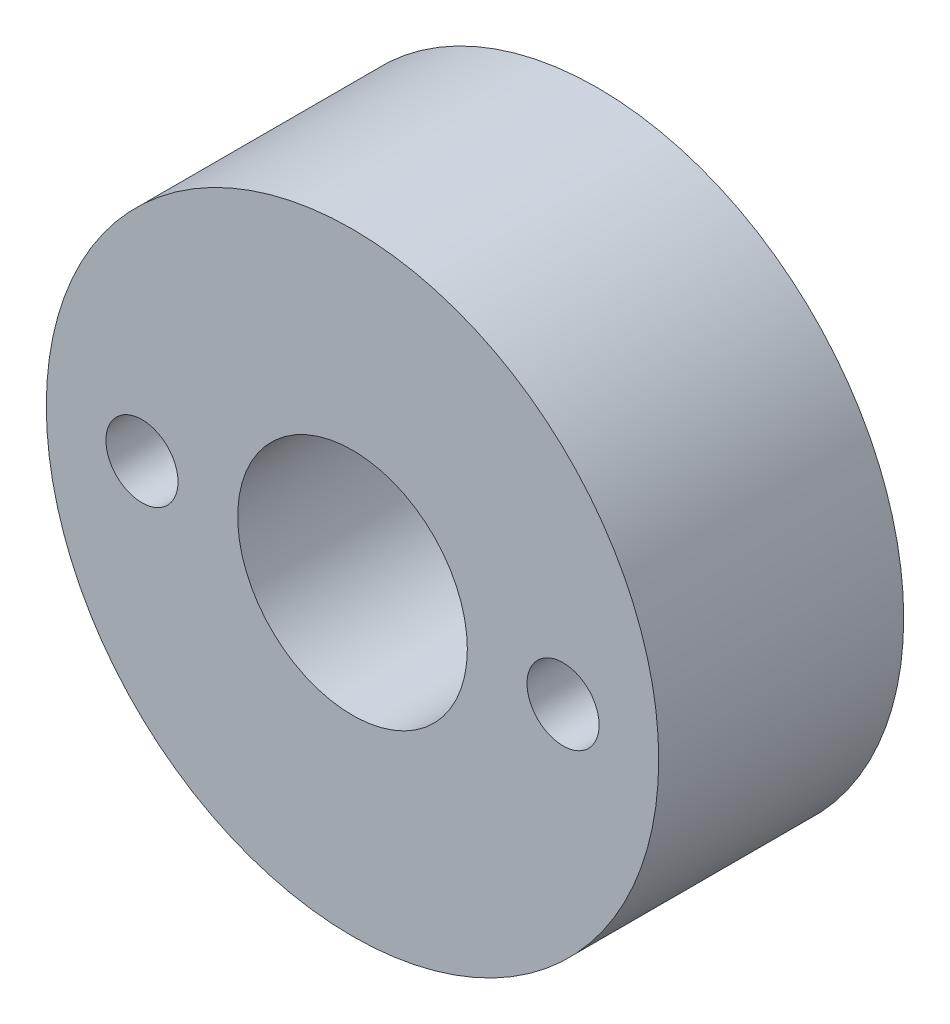
ISO-10303-21;
HEADER;
FILE_DESCRIPTION(('STEP AP214'),'2;1');
FILE_NAME('part.step','',(''),(''),'','','');
FILE_SCHEMA(('AUTOMOTIVE_DESIGN { 1 0 10303 214 1 1 1 1 }'));
ENDSEC;
DATA;
#1=APPLICATION_CONTEXT('core data for automotive mechanical design processes');
#2=APPLICATION_PROTOCOL_DEFINITION('international standard','automotive_design',2000,#1);
#3=PRODUCT_CONTEXT('',#1,'mechanical');
#4=PRODUCT('Part','Part','',(#3));
#5=PRODUCT_RELATED_PRODUCT_CATEGORY('part','',(#4));
#6=PRODUCT_DEFINITION_FORMATION('','',#4);
#7=PRODUCT_DEFINITION_CONTEXT('part definition',#1,'design');
#8=PRODUCT_DEFINITION('design','',#6,#7);
#9=PRODUCT_DEFINITION_SHAPE('','',#8);
#10=(LENGTH_UNIT() NAMED_UNIT(*) SI_UNIT(.MILLI.,.METRE.));
#11=(NAMED_UNIT(*) PLANE_ANGLE_UNIT() SI_UNIT($,.RADIAN.));
#12=(NAMED_UNIT(*) SI_UNIT($,.STERADIAN.) SOLID_ANGLE_UNIT());
#13=UNCERTAINTY_MEASURE_WITH_UNIT(LENGTH_MEASURE(1.E-05),#10,'distance_accuracy_value','');
#14=(GEOMETRIC_REPRESENTATION_CONTEXT(3) GLOBAL_UNCERTAINTY_ASSIGNED_CONTEXT((#13)) GLOBAL_UNIT_ASSIGNED_CONTEXT((#10,
#11,#12)) REPRESENTATION_CONTEXT('',''));
#15=CARTESIAN_POINT('',(0.,0.,0.));
#16=DIRECTION('',(0.,0.,1.));
#17=DIRECTION('',(1.,0.,0.));
#18=AXIS2_PLACEMENT_3D('',#15,#16,#17);
#19=CARTESIAN_POINT('',(0.,0.,5.08));
#20=DIRECTION('',(0.,0.,1.));
#21=DIRECTION('',(1.,0.,0.));
#22=AXIS2_PLACEMENT_3D('',#19,#20,#21);
#23=PLANE('',#22);
#24=CARTESIAN_POINT('',(-8.73252,0.,5.08));
#25=DIRECTION('',(0.,0.,1.));
#26=DIRECTION('',(1.,0.,0.));
#27=AXIS2_PLACEMENT_3D('',#24,#25,#26);
#28=CIRCLE('',#27,1.49479);
#29=CARTESIAN_POINT('',(-7.23773,0.,5.08));
#30=VERTEX_POINT('',#29);
#31=EDGE_CURVE('E55',#30,#30,#28,.T.);
#32=ORIENTED_EDGE('',*,*,#31,.F.);
#33=EDGE_LOOP('',(#32));
#34=FACE_BOUND('',#33,.T.);
#35=CARTESIAN_POINT('',(8.73252,0.,5.08));
#36=DIRECTION('',(0.,0.,1.));
#37=DIRECTION('',(1.,0.,0.));
#38=AXIS2_PLACEMENT_3D('',#35,#36,#37);
#39=CIRCLE('',#38,1.49479);
#40=CARTESIAN_POINT('',(10.22731,0.,5.08));
#41=VERTEX_POINT('',#40);
#42=EDGE_CURVE('E49',#41,#41,#39,.T.);
#43=ORIENTED_EDGE('',*,*,#42,.F.);
#44=EDGE_LOOP('',(#43));
#45=FACE_BOUND('',#44,.T.);
#46=CARTESIAN_POINT('',(0.,0.,5.08));
#47=DIRECTION('',(0.,0.,1.));
#48=DIRECTION('',(1.,0.,0.));
#49=AXIS2_PLACEMENT_3D('',#46,#47,#48);
#50=CIRCLE('',#49,12.7);
#51=CARTESIAN_POINT('',(12.7,0.,5.08));
#52=VERTEX_POINT('',#51);
#53=EDGE_CURVE('E10',#52,#52,#50,.T.);
#54=ORIENTED_EDGE('',*,*,#53,.T.);
#55=EDGE_LOOP('',(#54));
#56=FACE_BOUND('',#55,.T.);
#57=CARTESIAN_POINT('',(0.,0.,5.08));
#58=DIRECTION('',(0.,0.,1.));
#59=DIRECTION('',(1.,0.,0.));
#60=AXIS2_PLACEMENT_3D('',#57,#58,#59);
#61=CIRCLE('',#60,4.7625);
#62=CARTESIAN_POINT('',(4.7625,0.,5.08));
#63=VERTEX_POINT('',#62);
#64=EDGE_CURVE('E41',#63,#63,#61,.T.);
#65=ORIENTED_EDGE('',*,*,#64,.F.);
#66=EDGE_LOOP('',(#65));
#67=FACE_BOUND('',#66,.T.);
#68=ADVANCED_FACE('F30',(#34,#45,#56,#67),#23,.T.);
#69=CARTESIAN_POINT('',(0.,0.,-5.08));
#70=DIRECTION('',(0.,0.,1.));
#71=DIRECTION('',(1.,0.,0.));
#72=AXIS2_PLACEMENT_3D('',#69,#70,#71);
#73=PLANE('',#72);
#74=CARTESIAN_POINT('',(-8.73252,0.,-5.08));
#75=DIRECTION('',(0.,0.,1.));
#76=DIRECTION('',(1.,0.,0.));
#77=AXIS2_PLACEMENT_3D('',#74,#75,#76);
#78=CIRCLE('',#77,1.49479);
#79=CARTESIAN_POINT('',(-7.23773,0.,-5.08));
#80=VERTEX_POINT('',#79);
#81=EDGE_CURVE('E52',#80,#80,#78,.T.);
#82=ORIENTED_EDGE('',*,*,#81,.T.);
#83=EDGE_LOOP('',(#82));
#84=FACE_BOUND('',#83,.T.);
#85=CARTESIAN_POINT('',(8.73252,0.,-5.08));
#86=DIRECTION('',(0.,0.,1.));
#87=DIRECTION('',(1.,0.,0.));
#88=AXIS2_PLACEMENT_3D('',#85,#86,#87);
#89=CIRCLE('',#88,1.49479);
#90=CARTESIAN_POINT('',(10.22731,0.,-5.08));
#91=VERTEX_POINT('',#90);
#92=EDGE_CURVE('E46',#91,#91,#89,.T.);
#93=ORIENTED_EDGE('',*,*,#92,.T.);
#94=EDGE_LOOP('',(#93));
#95=FACE_BOUND('',#94,.T.);
#96=CARTESIAN_POINT('',(0.,0.,-5.08));
#97=DIRECTION('',(0.,0.,1.));
#98=DIRECTION('',(1.,0.,0.));
#99=AXIS2_PLACEMENT_3D('',#96,#97,#98);
#100=CIRCLE('',#99,12.7);
#101=CARTESIAN_POINT('',(12.7,0.,-5.08));
#102=VERTEX_POINT('',#101);
#103=EDGE_CURVE('E34',#102,#102,#100,.T.);
#104=ORIENTED_EDGE('',*,*,#103,.F.);
#105=EDGE_LOOP('',(#104));
#106=FACE_BOUND('',#105,.T.);
#107=CARTESIAN_POINT('',(0.,0.,-5.08));
#108=DIRECTION('',(0.,0.,1.));
#109=DIRECTION('',(1.,0.,0.));
#110=AXIS2_PLACEMENT_3D('',#107,#108,#109);
#111=CIRCLE('',#110,4.7625);
#112=CARTESIAN_POINT('',(4.7625,0.,-5.08));
#113=VERTEX_POINT('',#112);
#114=EDGE_CURVE('E43',#113,#113,#111,.T.);
#115=ORIENTED_EDGE('',*,*,#114,.T.);
#116=EDGE_LOOP('',(#115));
#117=FACE_BOUND('',#116,.T.);
#118=ADVANCED_FACE('F61',(#84,#95,#106,#117),#73,.F.);
#119=CARTESIAN_POINT('',(0.,0.,5.08));
#120=DIRECTION('',(0.,0.,-1.));
#121=DIRECTION('',(-1.,0.,0.));
#122=AXIS2_PLACEMENT_3D('',#119,#120,#121);
#123=CYLINDRICAL_SURFACE('',#122,12.7);
#124=ORIENTED_EDGE('',*,*,#53,.F.);
#125=EDGE_LOOP('',(#124));
#126=FACE_BOUND('',#125,.T.);
#127=ORIENTED_EDGE('',*,*,#103,.T.);
#128=EDGE_LOOP('',(#127));
#129=FACE_BOUND('',#128,.T.);
#130=ADVANCED_FACE('F32',(#126,#129),#123,.T.);
#131=CARTESIAN_POINT('',(0.,0.,5.08));
#132=DIRECTION('',(0.,0.,-1.));
#133=DIRECTION('',(-1.,0.,0.));
#134=AXIS2_PLACEMENT_3D('',#131,#132,#133);
#135=CYLINDRICAL_SURFACE('',#134,4.7625);
#136=ORIENTED_EDGE('',*,*,#64,.T.);
#137=EDGE_LOOP('',(#136));
#138=FACE_BOUND('',#137,.T.);
#139=ORIENTED_EDGE('',*,*,#114,.F.);
#140=EDGE_LOOP('',(#139));
#141=FACE_BOUND('',#140,.T.);
#142=ADVANCED_FACE('F78',(#138,#141),#135,.F.);
#143=CARTESIAN_POINT('',(8.73252,0.,-5.08));
#144=DIRECTION('',(0.,0.,1.));
#145=DIRECTION('',(1.,0.,0.));
#146=AXIS2_PLACEMENT_3D('',#143,#144,#145);
#147=CYLINDRICAL_SURFACE('',#146,1.49479);
#148=ORIENTED_EDGE('',*,*,#92,.F.);
#149=EDGE_LOOP('',(#148));
#150=FACE_BOUND('',#149,.T.);
#151=ORIENTED_EDGE('',*,*,#42,.T.);
#152=EDGE_LOOP('',(#151));
#153=FACE_BOUND('',#152,.T.);
#154=ADVANCED_FACE('F67',(#150,#153),#147,.F.);
#155=CARTESIAN_POINT('',(-8.73252,0.,-5.08));
#156=DIRECTION('',(0.,0.,1.));
#157=DIRECTION('',(1.,0.,0.));
#158=AXIS2_PLACEMENT_3D('',#155,#156,#157);
#159=CYLINDRICAL_SURFACE('',#158,1.49479);
#160=ORIENTED_EDGE('',*,*,#81,.F.);
#161=EDGE_LOOP('',(#160));
#162=FACE_BOUND('',#161,.T.);
#163=ORIENTED_EDGE('',*,*,#31,.T.);
#164=EDGE_LOOP('',(#163));
#165=FACE_BOUND('',#164,.T.);
#166=ADVANCED_FACE('F64',(#162,#165),#159,.F.);
#167=CLOSED_SHELL('',(#68,#118,#130,#142,#154,#166));
#168=MANIFOLD_SOLID_BREP('B2',#167);
#169=ADVANCED_BREP_SHAPE_REPRESENTATION('',(#18,#168),#14);
#170=SHAPE_DEFINITION_REPRESENTATION(#9,#169);
ENDSEC;
END-ISO-10303-21;
